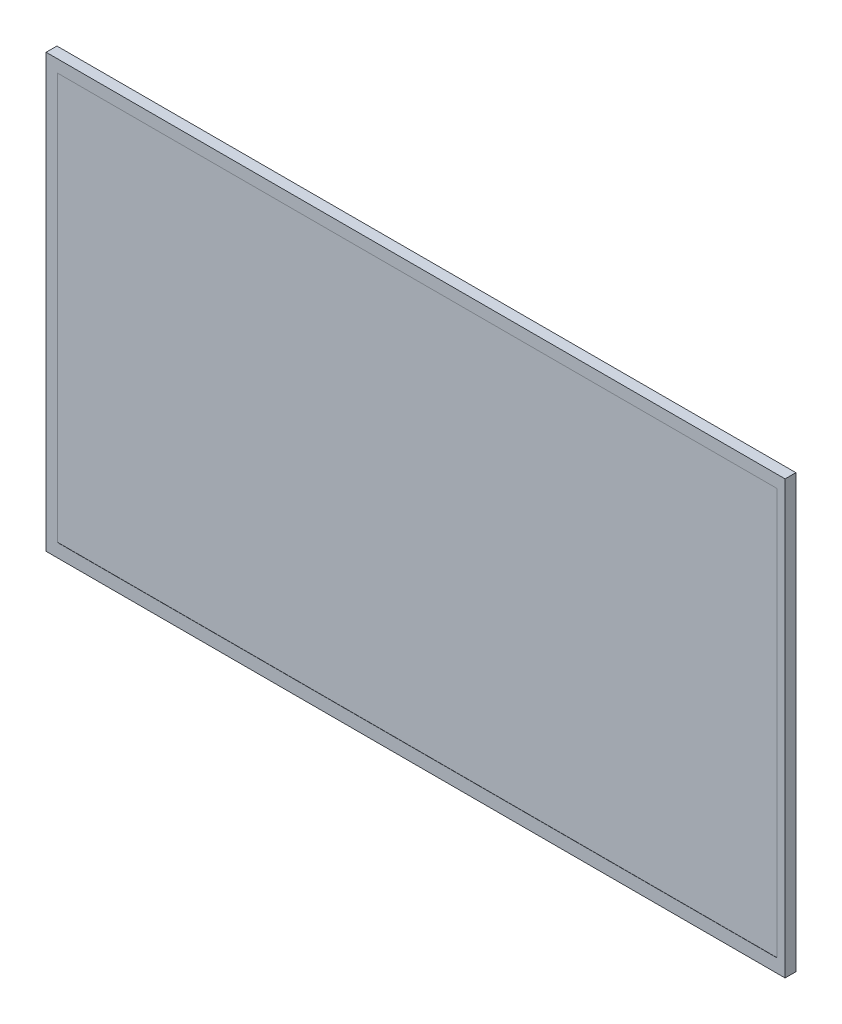
ISO-10303-21;
HEADER;
FILE_DESCRIPTION(('STEP AP214'),'2;1');
FILE_NAME('part.step','',(''),(''),'','','');
FILE_SCHEMA(('AUTOMOTIVE_DESIGN { 1 0 10303 214 1 1 1 1 }'));
ENDSEC;
DATA;
#1=APPLICATION_CONTEXT('core data for automotive mechanical design processes');
#2=APPLICATION_PROTOCOL_DEFINITION('international standard','automotive_design',2000,#1);
#3=PRODUCT_CONTEXT('',#1,'mechanical');
#4=PRODUCT('Part','Part','',(#3));
#5=PRODUCT_RELATED_PRODUCT_CATEGORY('part','',(#4));
#6=PRODUCT_DEFINITION_FORMATION('','',#4);
#7=PRODUCT_DEFINITION_CONTEXT('part definition',#1,'design');
#8=PRODUCT_DEFINITION('design','',#6,#7);
#9=PRODUCT_DEFINITION_SHAPE('','',#8);
#10=(LENGTH_UNIT() NAMED_UNIT(*) SI_UNIT(.MILLI.,.METRE.));
#11=(NAMED_UNIT(*) PLANE_ANGLE_UNIT() SI_UNIT($,.RADIAN.));
#12=(NAMED_UNIT(*) SI_UNIT($,.STERADIAN.) SOLID_ANGLE_UNIT());
#13=UNCERTAINTY_MEASURE_WITH_UNIT(LENGTH_MEASURE(1.E-05),#10,'distance_accuracy_value','');
#14=(GEOMETRIC_REPRESENTATION_CONTEXT(3) GLOBAL_UNCERTAINTY_ASSIGNED_CONTEXT((#13)) GLOBAL_UNIT_ASSIGNED_CONTEXT((#10,
#11,#12)) REPRESENTATION_CONTEXT('',''));
#15=CARTESIAN_POINT('',(0.,0.,0.));
#16=DIRECTION('',(0.,0.,1.));
#17=DIRECTION('',(1.,0.,0.));
#18=AXIS2_PLACEMENT_3D('',#15,#16,#17);
#19=CARTESIAN_POINT('',(0.,0.,0.));
#20=DIRECTION('',(0.,0.,1.));
#21=DIRECTION('',(1.,0.,0.));
#22=AXIS2_PLACEMENT_3D('',#19,#20,#21);
#23=PLANE('',#22);
#24=DIRECTION('',(0.,-1.,0.));
#25=VECTOR('',#24,1.);
#26=CARTESIAN_POINT('',(113.5,-64.,0.));
#27=LINE('',#26,#25);
#28=CARTESIAN_POINT('',(113.5,-64.,0.));
#29=VERTEX_POINT('',#28);
#30=CARTESIAN_POINT('',(113.5,-105.,0.));
#31=VERTEX_POINT('',#30);
#32=EDGE_CURVE('E48',#29,#31,#27,.T.);
#33=ORIENTED_EDGE('',*,*,#32,.F.);
#34=DIRECTION('',(1.,0.,0.));
#35=VECTOR('',#34,1.);
#36=CARTESIAN_POINT('',(113.5,-64.,0.));
#37=LINE('',#36,#35);
#38=CARTESIAN_POINT('',(-113.,-64.,0.));
#39=VERTEX_POINT('',#38);
#40=EDGE_CURVE('E211',#39,#29,#37,.T.);
#41=ORIENTED_EDGE('',*,*,#40,.F.);
#42=DIRECTION('',(0.,1.,0.));
#43=VECTOR('',#42,1.);
#44=CARTESIAN_POINT('',(-113.,-64.,0.));
#45=LINE('',#44,#43);
#46=CARTESIAN_POINT('',(-113.,-105.,0.));
#47=VERTEX_POINT('',#46);
#48=EDGE_CURVE('E382',#47,#39,#45,.T.);
#49=ORIENTED_EDGE('',*,*,#48,.F.);
#50=DIRECTION('',(1.,0.,0.));
#51=VECTOR('',#50,1.);
#52=CARTESIAN_POINT('',(-179.5,-105.,0.));
#53=LINE('',#52,#51);
#54=CARTESIAN_POINT('',(-179.5,-105.,0.));
#55=VERTEX_POINT('',#54);
#56=EDGE_CURVE('E358',#55,#47,#53,.T.);
#57=ORIENTED_EDGE('',*,*,#56,.F.);
#58=DIRECTION('',(0.,-1.,0.));
#59=VECTOR('',#58,1.);
#60=CARTESIAN_POINT('',(-179.5,105.,0.));
#61=LINE('',#60,#59);
#62=CARTESIAN_POINT('',(-179.5,105.,0.));
#63=VERTEX_POINT('',#62);
#64=EDGE_CURVE('E337',#63,#55,#61,.T.);
#65=ORIENTED_EDGE('',*,*,#64,.F.);
#66=DIRECTION('',(-1.,0.,0.));
#67=VECTOR('',#66,1.);
#68=CARTESIAN_POINT('',(-179.5,105.,0.));
#69=LINE('',#68,#67);
#70=CARTESIAN_POINT('',(179.5,105.,0.));
#71=VERTEX_POINT('',#70);
#72=EDGE_CURVE('E348',#71,#63,#69,.T.);
#73=ORIENTED_EDGE('',*,*,#72,.F.);
#74=DIRECTION('',(0.,1.,0.));
#75=VECTOR('',#74,1.);
#76=CARTESIAN_POINT('',(179.5,105.,0.));
#77=LINE('',#76,#75);
#78=CARTESIAN_POINT('',(179.5,-105.,0.));
#79=VERTEX_POINT('',#78);
#80=EDGE_CURVE('E360',#79,#71,#77,.T.);
#81=ORIENTED_EDGE('',*,*,#80,.F.);
#82=EDGE_CURVE('E357',#31,#79,#53,.T.);
#83=ORIENTED_EDGE('',*,*,#82,.F.);
#84=EDGE_LOOP('',(#33,#41,#49,#57,#65,#73,#81,#83));
#85=FACE_BOUND('',#84,.T.);
#86=ADVANCED_FACE('F33',(#85),#23,.F.);
#87=CARTESIAN_POINT('',(-179.5,105.,5.25));
#88=DIRECTION('',(1.,0.,0.));
#89=DIRECTION('',(0.,0.,-1.));
#90=AXIS2_PLACEMENT_3D('',#87,#88,#89);
#91=PLANE('',#90);
#92=ORIENTED_EDGE('',*,*,#64,.T.);
#93=DIRECTION('',(0.,0.,-1.));
#94=VECTOR('',#93,1.);
#95=CARTESIAN_POINT('',(-179.5,-105.,5.25));
#96=LINE('',#95,#94);
#97=CARTESIAN_POINT('',(-179.5,-105.,5.25));
#98=VERTEX_POINT('',#97);
#99=EDGE_CURVE('E41',#98,#55,#96,.T.);
#100=ORIENTED_EDGE('',*,*,#99,.F.);
#101=DIRECTION('',(0.,-1.,0.));
#102=VECTOR('',#101,1.);
#103=CARTESIAN_POINT('',(-179.5,105.,5.25));
#104=LINE('',#103,#102);
#105=CARTESIAN_POINT('',(-179.5,105.,5.25));
#106=VERTEX_POINT('',#105);
#107=EDGE_CURVE('E344',#106,#98,#104,.T.);
#108=ORIENTED_EDGE('',*,*,#107,.F.);
#109=DIRECTION('',(0.,0.,-1.));
#110=VECTOR('',#109,1.);
#111=CARTESIAN_POINT('',(-179.5,105.,5.25));
#112=LINE('',#111,#110);
#113=EDGE_CURVE('E354',#106,#63,#112,.T.);
#114=ORIENTED_EDGE('',*,*,#113,.T.);
#115=EDGE_LOOP('',(#92,#100,#108,#114));
#116=FACE_BOUND('',#115,.T.);
#117=ADVANCED_FACE('F35',(#116),#91,.F.);
#118=CARTESIAN_POINT('',(-179.5,-105.,5.25));
#119=DIRECTION('',(0.,1.,0.));
#120=DIRECTION('',(0.,0.,1.));
#121=AXIS2_PLACEMENT_3D('',#118,#119,#120);
#122=PLANE('',#121);
#123=ORIENTED_EDGE('',*,*,#56,.T.);
#124=DIRECTION('',(0.,0.,1.));
#125=VECTOR('',#124,1.);
#126=CARTESIAN_POINT('',(-113.,-105.,-0.25));
#127=LINE('',#126,#125);
#128=CARTESIAN_POINT('',(-113.,-105.,-0.25));
#129=VERTEX_POINT('',#128);
#130=EDGE_CURVE('E200',#129,#47,#127,.T.);
#131=ORIENTED_EDGE('',*,*,#130,.F.);
#132=DIRECTION('',(-1.,0.,0.));
#133=VECTOR('',#132,1.);
#134=CARTESIAN_POINT('',(113.5,-105.,-0.25));
#135=LINE('',#134,#133);
#136=CARTESIAN_POINT('',(113.5,-105.,-0.25));
#137=VERTEX_POINT('',#136);
#138=EDGE_CURVE('E194',#137,#129,#135,.T.);
#139=ORIENTED_EDGE('',*,*,#138,.F.);
#140=DIRECTION('',(0.,0.,1.));
#141=VECTOR('',#140,1.);
#142=CARTESIAN_POINT('',(113.5,-105.,-0.25));
#143=LINE('',#142,#141);
#144=EDGE_CURVE('E198',#137,#31,#143,.T.);
#145=ORIENTED_EDGE('',*,*,#144,.T.);
#146=ORIENTED_EDGE('',*,*,#82,.T.);
#147=DIRECTION('',(0.,0.,-1.));
#148=VECTOR('',#147,1.);
#149=CARTESIAN_POINT('',(179.5,-105.,5.25));
#150=LINE('',#149,#148);
#151=CARTESIAN_POINT('',(179.5,-105.,5.25));
#152=VERTEX_POINT('',#151);
#153=EDGE_CURVE('E368',#152,#79,#150,.T.);
#154=ORIENTED_EDGE('',*,*,#153,.F.);
#155=DIRECTION('',(1.,0.,0.));
#156=VECTOR('',#155,1.);
#157=CARTESIAN_POINT('',(-179.5,-105.,5.25));
#158=LINE('',#157,#156);
#159=EDGE_CURVE('E347',#98,#152,#158,.T.);
#160=ORIENTED_EDGE('',*,*,#159,.F.);
#161=ORIENTED_EDGE('',*,*,#99,.T.);
#162=EDGE_LOOP('',(#123,#131,#139,#145,#146,#154,#160,#161));
#163=FACE_BOUND('',#162,.T.);
#164=ADVANCED_FACE('F197',(#163),#122,.F.);
#165=CARTESIAN_POINT('',(179.5,105.,5.25));
#166=DIRECTION('',(-1.,0.,0.));
#167=DIRECTION('',(0.,-1.,0.));
#168=AXIS2_PLACEMENT_3D('',#165,#166,#167);
#169=PLANE('',#168);
#170=ORIENTED_EDGE('',*,*,#80,.T.);
#171=DIRECTION('',(0.,0.,-1.));
#172=VECTOR('',#171,1.);
#173=CARTESIAN_POINT('',(179.5,105.,5.25));
#174=LINE('',#173,#172);
#175=CARTESIAN_POINT('',(179.5,105.,5.25));
#176=VERTEX_POINT('',#175);
#177=EDGE_CURVE('E365',#176,#71,#174,.T.);
#178=ORIENTED_EDGE('',*,*,#177,.F.);
#179=DIRECTION('',(0.,1.,0.));
#180=VECTOR('',#179,1.);
#181=CARTESIAN_POINT('',(179.5,105.,5.25));
#182=LINE('',#181,#180);
#183=EDGE_CURVE('E350',#152,#176,#182,.T.);
#184=ORIENTED_EDGE('',*,*,#183,.F.);
#185=ORIENTED_EDGE('',*,*,#153,.T.);
#186=EDGE_LOOP('',(#170,#178,#184,#185));
#187=FACE_BOUND('',#186,.T.);
#188=ADVANCED_FACE('F417',(#187),#169,.F.);
#189=CARTESIAN_POINT('',(-179.5,105.,5.25));
#190=DIRECTION('',(0.,-1.,0.));
#191=DIRECTION('',(0.,0.,-1.));
#192=AXIS2_PLACEMENT_3D('',#189,#190,#191);
#193=PLANE('',#192);
#194=ORIENTED_EDGE('',*,*,#72,.T.);
#195=ORIENTED_EDGE('',*,*,#113,.F.);
#196=DIRECTION('',(-1.,0.,0.));
#197=VECTOR('',#196,1.);
#198=CARTESIAN_POINT('',(-179.5,105.,5.25));
#199=LINE('',#198,#197);
#200=EDGE_CURVE('E352',#176,#106,#199,.T.);
#201=ORIENTED_EDGE('',*,*,#200,.F.);
#202=ORIENTED_EDGE('',*,*,#177,.T.);
#203=EDGE_LOOP('',(#194,#195,#201,#202));
#204=FACE_BOUND('',#203,.T.);
#205=ADVANCED_FACE('F414',(#204),#193,.F.);
#206=CARTESIAN_POINT('',(0.,0.,5.25));
#207=DIRECTION('',(0.,0.,1.));
#208=DIRECTION('',(1.,0.,0.));
#209=AXIS2_PLACEMENT_3D('',#206,#207,#208);
#210=PLANE('',#209);
#211=DIRECTION('',(0.,-1.,0.));
#212=VECTOR('',#211,1.);
#213=CARTESIAN_POINT('',(-174.,99.,5.25));
#214=LINE('',#213,#212);
#215=CARTESIAN_POINT('',(-174.,99.,5.25));
#216=VERTEX_POINT('',#215);
#217=CARTESIAN_POINT('',(-174.,-98.5,5.25));
#218=VERTEX_POINT('',#217);
#219=EDGE_CURVE('E311',#216,#218,#214,.T.);
#220=ORIENTED_EDGE('',*,*,#219,.F.);
#221=DIRECTION('',(-1.,0.,0.));
#222=VECTOR('',#221,1.);
#223=CARTESIAN_POINT('',(-174.,99.,5.25));
#224=LINE('',#223,#222);
#225=CARTESIAN_POINT('',(175.5,99.,5.25));
#226=VERTEX_POINT('',#225);
#227=EDGE_CURVE('E316',#226,#216,#224,.T.);
#228=ORIENTED_EDGE('',*,*,#227,.F.);
#229=DIRECTION('',(0.,1.,0.));
#230=VECTOR('',#229,1.);
#231=CARTESIAN_POINT('',(175.5,99.,5.25));
#232=LINE('',#231,#230);
#233=CARTESIAN_POINT('',(175.5,-98.5,5.25));
#234=VERTEX_POINT('',#233);
#235=EDGE_CURVE('E330',#234,#226,#232,.T.);
#236=ORIENTED_EDGE('',*,*,#235,.F.);
#237=DIRECTION('',(1.,0.,0.));
#238=VECTOR('',#237,1.);
#239=CARTESIAN_POINT('',(-174.,-98.5,5.25));
#240=LINE('',#239,#238);
#241=EDGE_CURVE('E327',#218,#234,#240,.T.);
#242=ORIENTED_EDGE('',*,*,#241,.F.);
#243=EDGE_LOOP('',(#220,#228,#236,#242));
#244=FACE_BOUND('',#243,.T.);
#245=ORIENTED_EDGE('',*,*,#107,.T.);
#246=ORIENTED_EDGE('',*,*,#159,.T.);
#247=ORIENTED_EDGE('',*,*,#183,.T.);
#248=ORIENTED_EDGE('',*,*,#200,.T.);
#249=EDGE_LOOP('',(#245,#246,#247,#248));
#250=FACE_BOUND('',#249,.T.);
#251=ADVANCED_FACE('F412',(#244,#250),#210,.T.);
#252=CARTESIAN_POINT('',(-174.,99.,5.15));
#253=DIRECTION('',(-1.,0.,0.));
#254=DIRECTION('',(0.,-1.,0.));
#255=AXIS2_PLACEMENT_3D('',#252,#253,#254);
#256=PLANE('',#255);
#257=ORIENTED_EDGE('',*,*,#219,.T.);
#258=DIRECTION('',(0.,0.,1.));
#259=VECTOR('',#258,1.);
#260=CARTESIAN_POINT('',(-174.,-98.5,5.15));
#261=LINE('',#260,#259);
#262=CARTESIAN_POINT('',(-174.,-98.5,5.15));
#263=VERTEX_POINT('',#262);
#264=EDGE_CURVE('E325',#263,#218,#261,.T.);
#265=ORIENTED_EDGE('',*,*,#264,.F.);
#266=DIRECTION('',(0.,-1.,0.));
#267=VECTOR('',#266,1.);
#268=CARTESIAN_POINT('',(-174.,99.,5.15));
#269=LINE('',#268,#267);
#270=CARTESIAN_POINT('',(-174.,99.,5.15));
#271=VERTEX_POINT('',#270);
#272=EDGE_CURVE('E312',#271,#263,#269,.T.);
#273=ORIENTED_EDGE('',*,*,#272,.F.);
#274=DIRECTION('',(0.,0.,1.));
#275=VECTOR('',#274,1.);
#276=CARTESIAN_POINT('',(-174.,99.,5.15));
#277=LINE('',#276,#275);
#278=EDGE_CURVE('E335',#271,#216,#277,.T.);
#279=ORIENTED_EDGE('',*,*,#278,.T.);
#280=EDGE_LOOP('',(#257,#265,#273,#279));
#281=FACE_BOUND('',#280,.T.);
#282=ADVANCED_FACE('F441',(#281),#256,.F.);
#283=CARTESIAN_POINT('',(-174.,99.,5.15));
#284=DIRECTION('',(0.,1.,0.));
#285=DIRECTION('',(0.,0.,1.));
#286=AXIS2_PLACEMENT_3D('',#283,#284,#285);
#287=PLANE('',#286);
#288=ORIENTED_EDGE('',*,*,#227,.T.);
#289=ORIENTED_EDGE('',*,*,#278,.F.);
#290=DIRECTION('',(-1.,0.,0.));
#291=VECTOR('',#290,1.);
#292=CARTESIAN_POINT('',(-174.,99.,5.15));
#293=LINE('',#292,#291);
#294=CARTESIAN_POINT('',(175.5,99.,5.15));
#295=VERTEX_POINT('',#294);
#296=EDGE_CURVE('E322',#295,#271,#293,.T.);
#297=ORIENTED_EDGE('',*,*,#296,.F.);
#298=DIRECTION('',(0.,0.,1.));
#299=VECTOR('',#298,1.);
#300=CARTESIAN_POINT('',(175.5,99.,5.15));
#301=LINE('',#300,#299);
#302=EDGE_CURVE('E338',#295,#226,#301,.T.);
#303=ORIENTED_EDGE('',*,*,#302,.T.);
#304=EDGE_LOOP('',(#288,#289,#297,#303));
#305=FACE_BOUND('',#304,.T.);
#306=ADVANCED_FACE('F448',(#305),#287,.F.);
#307=CARTESIAN_POINT('',(175.5,99.,5.15));
#308=DIRECTION('',(1.,0.,0.));
#309=DIRECTION('',(0.,0.,-1.));
#310=AXIS2_PLACEMENT_3D('',#307,#308,#309);
#311=PLANE('',#310);
#312=ORIENTED_EDGE('',*,*,#235,.T.);
#313=ORIENTED_EDGE('',*,*,#302,.F.);
#314=DIRECTION('',(0.,1.,0.));
#315=VECTOR('',#314,1.);
#316=CARTESIAN_POINT('',(175.5,99.,5.15));
#317=LINE('',#316,#315);
#318=CARTESIAN_POINT('',(175.5,-98.5,5.15));
#319=VERTEX_POINT('',#318);
#320=EDGE_CURVE('E319',#319,#295,#317,.T.);
#321=ORIENTED_EDGE('',*,*,#320,.F.);
#322=DIRECTION('',(0.,0.,1.));
#323=VECTOR('',#322,1.);
#324=CARTESIAN_POINT('',(175.5,-98.5,5.15));
#325=LINE('',#324,#323);
#326=EDGE_CURVE('E340',#319,#234,#325,.T.);
#327=ORIENTED_EDGE('',*,*,#326,.T.);
#328=EDGE_LOOP('',(#312,#313,#321,#327));
#329=FACE_BOUND('',#328,.T.);
#330=ADVANCED_FACE('F455',(#329),#311,.F.);
#331=CARTESIAN_POINT('',(-174.,-98.5,5.15));
#332=DIRECTION('',(0.,-1.,0.));
#333=DIRECTION('',(1.,0.,0.));
#334=AXIS2_PLACEMENT_3D('',#331,#332,#333);
#335=PLANE('',#334);
#336=ORIENTED_EDGE('',*,*,#241,.T.);
#337=ORIENTED_EDGE('',*,*,#326,.F.);
#338=DIRECTION('',(1.,0.,0.));
#339=VECTOR('',#338,1.);
#340=CARTESIAN_POINT('',(-174.,-98.5,5.15));
#341=LINE('',#340,#339);
#342=EDGE_CURVE('E315',#263,#319,#341,.T.);
#343=ORIENTED_EDGE('',*,*,#342,.F.);
#344=ORIENTED_EDGE('',*,*,#264,.T.);
#345=EDGE_LOOP('',(#336,#337,#343,#344));
#346=FACE_BOUND('',#345,.T.);
#347=ADVANCED_FACE('F463',(#346),#335,.F.);
#348=CARTESIAN_POINT('',(0.,0.,5.15));
#349=DIRECTION('',(0.,0.,1.));
#350=DIRECTION('',(1.,0.,0.));
#351=AXIS2_PLACEMENT_3D('',#348,#349,#350);
#352=PLANE('',#351);
#353=ORIENTED_EDGE('',*,*,#272,.T.);
#354=ORIENTED_EDGE('',*,*,#342,.T.);
#355=ORIENTED_EDGE('',*,*,#320,.T.);
#356=ORIENTED_EDGE('',*,*,#296,.T.);
#357=EDGE_LOOP('',(#353,#354,#355,#356));
#358=FACE_BOUND('',#357,.T.);
#359=ADVANCED_FACE('F471',(#358),#352,.T.);
#360=CARTESIAN_POINT('',(0.,0.,-0.25));
#361=DIRECTION('',(0.,0.,-1.));
#362=DIRECTION('',(-1.,0.,0.));
#363=AXIS2_PLACEMENT_3D('',#360,#361,#362);
#364=PLANE('',#363);
#365=DIRECTION('',(0.,-1.,0.));
#366=VECTOR('',#365,1.);
#367=CARTESIAN_POINT('',(113.5,-64.,-0.25));
#368=LINE('',#367,#366);
#369=CARTESIAN_POINT('',(113.5,-64.,-0.25));
#370=VERTEX_POINT('',#369);
#371=EDGE_CURVE('E204',#370,#137,#368,.T.);
#372=ORIENTED_EDGE('',*,*,#371,.T.);
#373=ORIENTED_EDGE('',*,*,#138,.T.);
#374=DIRECTION('',(0.,1.,0.));
#375=VECTOR('',#374,1.);
#376=CARTESIAN_POINT('',(-113.,-64.,-0.25));
#377=LINE('',#376,#375);
#378=CARTESIAN_POINT('',(-113.,-64.,-0.25));
#379=VERTEX_POINT('',#378);
#380=EDGE_CURVE('E203',#129,#379,#377,.T.);
#381=ORIENTED_EDGE('',*,*,#380,.T.);
#382=DIRECTION('',(1.,0.,0.));
#383=VECTOR('',#382,1.);
#384=CARTESIAN_POINT('',(113.5,-64.,-0.25));
#385=LINE('',#384,#383);
#386=EDGE_CURVE('E209',#379,#370,#385,.T.);
#387=ORIENTED_EDGE('',*,*,#386,.T.);
#388=EDGE_LOOP('',(#372,#373,#381,#387));
#389=FACE_BOUND('',#388,.T.);
#390=DIRECTION('',(0.,-1.,0.));
#391=VECTOR('',#390,1.);
#392=CARTESIAN_POINT('',(74.3,-66.,-0.25));
#393=LINE('',#392,#391);
#394=CARTESIAN_POINT('',(74.3,-66.,-0.25));
#395=VERTEX_POINT('',#394);
#396=CARTESIAN_POINT('',(74.3,-70.,-0.25));
#397=VERTEX_POINT('',#396);
#398=EDGE_CURVE('E56',#395,#397,#393,.T.);
#399=ORIENTED_EDGE('',*,*,#398,.F.);
#400=DIRECTION('',(1.,0.,0.));
#401=VECTOR('',#400,1.);
#402=CARTESIAN_POINT('',(74.3,-66.,-0.25));
#403=LINE('',#402,#401);
#404=CARTESIAN_POINT('',(71.8,-66.,-0.25));
#405=VERTEX_POINT('',#404);
#406=EDGE_CURVE('E11',#405,#395,#403,.T.);
#407=ORIENTED_EDGE('',*,*,#406,.F.);
#408=DIRECTION('',(0.,1.,0.));
#409=VECTOR('',#408,1.);
#410=CARTESIAN_POINT('',(71.8,-66.,-0.25));
#411=LINE('',#410,#409);
#412=CARTESIAN_POINT('',(71.8,-67.,-0.25));
#413=VERTEX_POINT('',#412);
#414=EDGE_CURVE('E214',#413,#405,#411,.T.);
#415=ORIENTED_EDGE('',*,*,#414,.F.);
#416=DIRECTION('',(1.,0.,0.));
#417=VECTOR('',#416,1.);
#418=CARTESIAN_POINT('',(71.8,-67.,-0.25));
#419=LINE('',#418,#417);
#420=CARTESIAN_POINT('',(50.8000000000001,-67.,-0.25));
#421=VERTEX_POINT('',#420);
#422=EDGE_CURVE('E217',#421,#413,#419,.T.);
#423=ORIENTED_EDGE('',*,*,#422,.F.);
#424=DIRECTION('',(0.,-1.,0.));
#425=VECTOR('',#424,1.);
#426=CARTESIAN_POINT('',(50.8000000000002,-66.,-0.25));
#427=LINE('',#426,#425);
#428=CARTESIAN_POINT('',(50.8000000000002,-66.,-0.25));
#429=VERTEX_POINT('',#428);
#430=EDGE_CURVE('E225',#429,#421,#427,.T.);
#431=ORIENTED_EDGE('',*,*,#430,.F.);
#432=DIRECTION('',(1.,0.,0.));
#433=VECTOR('',#432,1.);
#434=CARTESIAN_POINT('',(48.3000000000001,-66.,-0.25));
#435=LINE('',#434,#433);
#436=CARTESIAN_POINT('',(48.3000000000001,-66.,-0.25));
#437=VERTEX_POINT('',#436);
#438=EDGE_CURVE('E228',#437,#429,#435,.T.);
#439=ORIENTED_EDGE('',*,*,#438,.F.);
#440=DIRECTION('',(0.,1.,0.));
#441=VECTOR('',#440,1.);
#442=CARTESIAN_POINT('',(48.3000000000001,-66.,-0.25));
#443=LINE('',#442,#441);
#444=CARTESIAN_POINT('',(48.3000000000001,-70.,-0.25));
#445=VERTEX_POINT('',#444);
#446=EDGE_CURVE('E231',#445,#437,#443,.T.);
#447=ORIENTED_EDGE('',*,*,#446,.F.);
#448=DIRECTION('',(-1.,0.,0.));
#449=VECTOR('',#448,1.);
#450=CARTESIAN_POINT('',(48.3000000000001,-70.,-0.25));
#451=LINE('',#450,#449);
#452=CARTESIAN_POINT('',(50.8000000000002,-70.,-0.25));
#453=VERTEX_POINT('',#452);
#454=EDGE_CURVE('E234',#453,#445,#451,.T.);
#455=ORIENTED_EDGE('',*,*,#454,.F.);
#456=DIRECTION('',(0.,-1.,0.));
#457=VECTOR('',#456,1.);
#458=CARTESIAN_POINT('',(50.8000000000001,-69.,-0.25));
#459=LINE('',#458,#457);
#460=CARTESIAN_POINT('',(50.8000000000001,-69.,-0.25));
#461=VERTEX_POINT('',#460);
#462=EDGE_CURVE('E237',#461,#453,#459,.T.);
#463=ORIENTED_EDGE('',*,*,#462,.F.);
#464=DIRECTION('',(-1.,0.,0.));
#465=VECTOR('',#464,1.);
#466=CARTESIAN_POINT('',(71.8,-69.,-0.25));
#467=LINE('',#466,#465);
#468=CARTESIAN_POINT('',(71.8,-69.,-0.25));
#469=VERTEX_POINT('',#468);
#470=EDGE_CURVE('E240',#469,#461,#467,.T.);
#471=ORIENTED_EDGE('',*,*,#470,.F.);
#472=DIRECTION('',(0.,1.,0.));
#473=VECTOR('',#472,1.);
#474=CARTESIAN_POINT('',(71.8,-69.,-0.25));
#475=LINE('',#474,#473);
#476=CARTESIAN_POINT('',(71.8,-70.,-0.25));
#477=VERTEX_POINT('',#476);
#478=EDGE_CURVE('E243',#477,#469,#475,.T.);
#479=ORIENTED_EDGE('',*,*,#478,.F.);
#480=DIRECTION('',(-1.,0.,0.));
#481=VECTOR('',#480,1.);
#482=CARTESIAN_POINT('',(74.3,-70.,-0.25));
#483=LINE('',#482,#481);
#484=EDGE_CURVE('E246',#397,#477,#483,.T.);
#485=ORIENTED_EDGE('',*,*,#484,.F.);
#486=EDGE_LOOP('',(#399,#407,#415,#423,#431,#439,#447,#455,#463,#471,#479,#485));
#487=FACE_BOUND('',#486,.T.);
#488=ADVANCED_FACE('F207',(#389,#487),#364,.T.);
#489=CARTESIAN_POINT('',(113.5,-64.,-0.25));
#490=DIRECTION('',(-1.,0.,0.));
#491=DIRECTION('',(0.,0.,1.));
#492=AXIS2_PLACEMENT_3D('',#489,#490,#491);
#493=PLANE('',#492);
#494=ORIENTED_EDGE('',*,*,#32,.T.);
#495=ORIENTED_EDGE('',*,*,#144,.F.);
#496=ORIENTED_EDGE('',*,*,#371,.F.);
#497=DIRECTION('',(0.,0.,1.));
#498=VECTOR('',#497,1.);
#499=CARTESIAN_POINT('',(113.5,-64.,-0.25));
#500=LINE('',#499,#498);
#501=EDGE_CURVE('E391',#370,#29,#500,.T.);
#502=ORIENTED_EDGE('',*,*,#501,.T.);
#503=EDGE_LOOP('',(#494,#495,#496,#502));
#504=FACE_BOUND('',#503,.T.);
#505=ADVANCED_FACE('F213',(#504),#493,.F.);
#506=CARTESIAN_POINT('',(-113.,-64.,-0.25));
#507=DIRECTION('',(1.,0.,0.));
#508=DIRECTION('',(0.,0.,-1.));
#509=AXIS2_PLACEMENT_3D('',#506,#507,#508);
#510=PLANE('',#509);
#511=ORIENTED_EDGE('',*,*,#48,.T.);
#512=DIRECTION('',(0.,0.,1.));
#513=VECTOR('',#512,1.);
#514=CARTESIAN_POINT('',(-113.,-64.,-0.25));
#515=LINE('',#514,#513);
#516=EDGE_CURVE('E219',#379,#39,#515,.T.);
#517=ORIENTED_EDGE('',*,*,#516,.F.);
#518=ORIENTED_EDGE('',*,*,#380,.F.);
#519=ORIENTED_EDGE('',*,*,#130,.T.);
#520=EDGE_LOOP('',(#511,#517,#518,#519));
#521=FACE_BOUND('',#520,.T.);
#522=ADVANCED_FACE('F394',(#521),#510,.F.);
#523=CARTESIAN_POINT('',(113.5,-64.,-0.25));
#524=DIRECTION('',(0.,-1.,0.));
#525=DIRECTION('',(0.,0.,-1.));
#526=AXIS2_PLACEMENT_3D('',#523,#524,#525);
#527=PLANE('',#526);
#528=ORIENTED_EDGE('',*,*,#40,.T.);
#529=ORIENTED_EDGE('',*,*,#501,.F.);
#530=ORIENTED_EDGE('',*,*,#386,.F.);
#531=ORIENTED_EDGE('',*,*,#516,.T.);
#532=EDGE_LOOP('',(#528,#529,#530,#531));
#533=FACE_BOUND('',#532,.T.);
#534=ADVANCED_FACE('F393',(#533),#527,.F.);
#535=CARTESIAN_POINT('',(0.,0.,-1.));
#536=DIRECTION('',(0.,0.,-1.));
#537=DIRECTION('',(-1.,0.,0.));
#538=AXIS2_PLACEMENT_3D('',#535,#536,#537);
#539=PLANE('',#538);
#540=DIRECTION('',(0.,-1.,0.));
#541=VECTOR('',#540,1.);
#542=CARTESIAN_POINT('',(74.3,-66.,-1.));
#543=LINE('',#542,#541);
#544=CARTESIAN_POINT('',(74.3,-66.,-1.));
#545=VERTEX_POINT('',#544);
#546=CARTESIAN_POINT('',(74.3,-70.,-1.));
#547=VERTEX_POINT('',#546);
#548=EDGE_CURVE('E250',#545,#547,#543,.T.);
#549=ORIENTED_EDGE('',*,*,#548,.T.);
#550=DIRECTION('',(-1.,0.,0.));
#551=VECTOR('',#550,1.);
#552=CARTESIAN_POINT('',(74.3,-70.,-1.));
#553=LINE('',#552,#551);
#554=CARTESIAN_POINT('',(71.8,-70.,-1.));
#555=VERTEX_POINT('',#554);
#556=EDGE_CURVE('E253',#547,#555,#553,.T.);
#557=ORIENTED_EDGE('',*,*,#556,.T.);
#558=DIRECTION('',(0.,1.,0.));
#559=VECTOR('',#558,1.);
#560=CARTESIAN_POINT('',(71.8,-69.,-1.));
#561=LINE('',#560,#559);
#562=CARTESIAN_POINT('',(71.8,-69.,-1.));
#563=VERTEX_POINT('',#562);
#564=EDGE_CURVE('E255',#555,#563,#561,.T.);
#565=ORIENTED_EDGE('',*,*,#564,.T.);
#566=DIRECTION('',(-1.,0.,0.));
#567=VECTOR('',#566,1.);
#568=CARTESIAN_POINT('',(71.8,-69.,-1.));
#569=LINE('',#568,#567);
#570=CARTESIAN_POINT('',(50.8000000000001,-69.,-1.));
#571=VERTEX_POINT('',#570);
#572=EDGE_CURVE('E257',#563,#571,#569,.T.);
#573=ORIENTED_EDGE('',*,*,#572,.T.);
#574=DIRECTION('',(0.,-1.,0.));
#575=VECTOR('',#574,1.);
#576=CARTESIAN_POINT('',(50.8000000000001,-69.,-1.));
#577=LINE('',#576,#575);
#578=CARTESIAN_POINT('',(50.8000000000002,-70.,-1.));
#579=VERTEX_POINT('',#578);
#580=EDGE_CURVE('E259',#571,#579,#577,.T.);
#581=ORIENTED_EDGE('',*,*,#580,.T.);
#582=DIRECTION('',(-1.,0.,0.));
#583=VECTOR('',#582,1.);
#584=CARTESIAN_POINT('',(48.3000000000001,-70.,-1.));
#585=LINE('',#584,#583);
#586=CARTESIAN_POINT('',(48.3000000000001,-70.,-1.));
#587=VERTEX_POINT('',#586);
#588=EDGE_CURVE('E261',#579,#587,#585,.T.);
#589=ORIENTED_EDGE('',*,*,#588,.T.);
#590=DIRECTION('',(0.,1.,0.));
#591=VECTOR('',#590,1.);
#592=CARTESIAN_POINT('',(48.3000000000001,-66.,-1.));
#593=LINE('',#592,#591);
#594=CARTESIAN_POINT('',(48.3000000000001,-66.,-1.));
#595=VERTEX_POINT('',#594);
#596=EDGE_CURVE('E263',#587,#595,#593,.T.);
#597=ORIENTED_EDGE('',*,*,#596,.T.);
#598=DIRECTION('',(1.,0.,0.));
#599=VECTOR('',#598,1.);
#600=CARTESIAN_POINT('',(48.3000000000001,-66.,-1.));
#601=LINE('',#600,#599);
#602=CARTESIAN_POINT('',(50.8000000000002,-66.,-1.));
#603=VERTEX_POINT('',#602);
#604=EDGE_CURVE('E265',#595,#603,#601,.T.);
#605=ORIENTED_EDGE('',*,*,#604,.T.);
#606=DIRECTION('',(0.,-1.,0.));
#607=VECTOR('',#606,1.);
#608=CARTESIAN_POINT('',(50.8000000000002,-66.,-1.));
#609=LINE('',#608,#607);
#610=CARTESIAN_POINT('',(50.8000000000001,-67.,-1.));
#611=VERTEX_POINT('',#610);
#612=EDGE_CURVE('E267',#603,#611,#609,.T.);
#613=ORIENTED_EDGE('',*,*,#612,.T.);
#614=DIRECTION('',(1.,0.,0.));
#615=VECTOR('',#614,1.);
#616=CARTESIAN_POINT('',(71.8,-67.,-1.));
#617=LINE('',#616,#615);
#618=CARTESIAN_POINT('',(71.8,-67.,-1.));
#619=VERTEX_POINT('',#618);
#620=EDGE_CURVE('E269',#611,#619,#617,.T.);
#621=ORIENTED_EDGE('',*,*,#620,.T.);
#622=DIRECTION('',(0.,1.,0.));
#623=VECTOR('',#622,1.);
#624=CARTESIAN_POINT('',(71.8,-66.,-1.));
#625=LINE('',#624,#623);
#626=CARTESIAN_POINT('',(71.8,-66.,-1.));
#627=VERTEX_POINT('',#626);
#628=EDGE_CURVE('E271',#619,#627,#625,.T.);
#629=ORIENTED_EDGE('',*,*,#628,.T.);
#630=DIRECTION('',(1.,0.,0.));
#631=VECTOR('',#630,1.);
#632=CARTESIAN_POINT('',(74.3,-66.,-1.));
#633=LINE('',#632,#631);
#634=EDGE_CURVE('E273',#627,#545,#633,.T.);
#635=ORIENTED_EDGE('',*,*,#634,.T.);
#636=EDGE_LOOP('',(#549,#557,#565,#573,#581,#589,#597,#605,#613,#621,#629,#635));
#637=FACE_BOUND('',#636,.T.);
#638=ADVANCED_FACE('F402',(#637),#539,.T.);
#639=CARTESIAN_POINT('',(74.3,-66.,-1.));
#640=DIRECTION('',(0.,-1.,0.));
#641=DIRECTION('',(0.,0.,-1.));
#642=AXIS2_PLACEMENT_3D('',#639,#640,#641);
#643=PLANE('',#642);
#644=DIRECTION('',(0.,0.,1.));
#645=VECTOR('',#644,1.);
#646=CARTESIAN_POINT('',(71.8,-66.,-1.));
#647=LINE('',#646,#645);
#648=EDGE_CURVE('E278',#627,#405,#647,.T.);
#649=ORIENTED_EDGE('',*,*,#648,.T.);
#650=ORIENTED_EDGE('',*,*,#406,.T.);
#651=DIRECTION('',(0.,0.,1.));
#652=VECTOR('',#651,1.);
#653=CARTESIAN_POINT('',(74.3,-66.,-1.));
#654=LINE('',#653,#652);
#655=EDGE_CURVE('E275',#545,#395,#654,.T.);
#656=ORIENTED_EDGE('',*,*,#655,.F.);
#657=ORIENTED_EDGE('',*,*,#634,.F.);
#658=EDGE_LOOP('',(#649,#650,#656,#657));
#659=FACE_BOUND('',#658,.T.);
#660=ADVANCED_FACE('F506',(#659),#643,.F.);
#661=CARTESIAN_POINT('',(71.8,-66.,-1.));
#662=DIRECTION('',(1.,0.,0.));
#663=DIRECTION('',(0.,1.,0.));
#664=AXIS2_PLACEMENT_3D('',#661,#662,#663);
#665=PLANE('',#664);
#666=DIRECTION('',(0.,0.,1.));
#667=VECTOR('',#666,1.);
#668=CARTESIAN_POINT('',(71.8,-67.,-1.));
#669=LINE('',#668,#667);
#670=EDGE_CURVE('E281',#619,#413,#669,.T.);
#671=ORIENTED_EDGE('',*,*,#670,.T.);
#672=ORIENTED_EDGE('',*,*,#414,.T.);
#673=ORIENTED_EDGE('',*,*,#648,.F.);
#674=ORIENTED_EDGE('',*,*,#628,.F.);
#675=EDGE_LOOP('',(#671,#672,#673,#674));
#676=FACE_BOUND('',#675,.T.);
#677=ADVANCED_FACE('F511',(#676),#665,.F.);
#678=CARTESIAN_POINT('',(71.8,-67.,-1.));
#679=DIRECTION('',(0.,-1.,0.));
#680=DIRECTION('',(0.,0.,-1.));
#681=AXIS2_PLACEMENT_3D('',#678,#679,#680);
#682=PLANE('',#681);
#683=DIRECTION('',(0.,0.,1.));
#684=VECTOR('',#683,1.);
#685=CARTESIAN_POINT('',(50.8000000000001,-67.,-1.));
#686=LINE('',#685,#684);
#687=EDGE_CURVE('E284',#611,#421,#686,.T.);
#688=ORIENTED_EDGE('',*,*,#687,.T.);
#689=ORIENTED_EDGE('',*,*,#422,.T.);
#690=ORIENTED_EDGE('',*,*,#670,.F.);
#691=ORIENTED_EDGE('',*,*,#620,.F.);
#692=EDGE_LOOP('',(#688,#689,#690,#691));
#693=FACE_BOUND('',#692,.T.);
#694=ADVANCED_FACE('F522',(#693),#682,.F.);
#695=CARTESIAN_POINT('',(50.8000000000002,-66.,-1.));
#696=DIRECTION('',(-1.,0.,0.));
#697=DIRECTION('',(0.,-1.,0.));
#698=AXIS2_PLACEMENT_3D('',#695,#696,#697);
#699=PLANE('',#698);
#700=DIRECTION('',(0.,0.,1.));
#701=VECTOR('',#700,1.);
#702=CARTESIAN_POINT('',(50.8000000000002,-66.,-1.));
#703=LINE('',#702,#701);
#704=EDGE_CURVE('E287',#603,#429,#703,.T.);
#705=ORIENTED_EDGE('',*,*,#704,.T.);
#706=ORIENTED_EDGE('',*,*,#430,.T.);
#707=ORIENTED_EDGE('',*,*,#687,.F.);
#708=ORIENTED_EDGE('',*,*,#612,.F.);
#709=EDGE_LOOP('',(#705,#706,#707,#708));
#710=FACE_BOUND('',#709,.T.);
#711=ADVANCED_FACE('F532',(#710),#699,.F.);
#712=CARTESIAN_POINT('',(48.3000000000001,-66.,-1.));
#713=DIRECTION('',(0.,-1.,0.));
#714=DIRECTION('',(0.,0.,-1.));
#715=AXIS2_PLACEMENT_3D('',#712,#713,#714);
#716=PLANE('',#715);
#717=DIRECTION('',(0.,0.,1.));
#718=VECTOR('',#717,1.);
#719=CARTESIAN_POINT('',(48.3000000000001,-66.,-1.));
#720=LINE('',#719,#718);
#721=EDGE_CURVE('E290',#595,#437,#720,.T.);
#722=ORIENTED_EDGE('',*,*,#721,.T.);
#723=ORIENTED_EDGE('',*,*,#438,.T.);
#724=ORIENTED_EDGE('',*,*,#704,.F.);
#725=ORIENTED_EDGE('',*,*,#604,.F.);
#726=EDGE_LOOP('',(#722,#723,#724,#725));
#727=FACE_BOUND('',#726,.T.);
#728=ADVANCED_FACE('F542',(#727),#716,.F.);
#729=CARTESIAN_POINT('',(48.3000000000001,-66.,-1.));
#730=DIRECTION('',(1.,0.,0.));
#731=DIRECTION('',(0.,0.,-1.));
#732=AXIS2_PLACEMENT_3D('',#729,#730,#731);
#733=PLANE('',#732);
#734=DIRECTION('',(0.,0.,1.));
#735=VECTOR('',#734,1.);
#736=CARTESIAN_POINT('',(48.3000000000001,-70.,-1.));
#737=LINE('',#736,#735);
#738=EDGE_CURVE('E293',#587,#445,#737,.T.);
#739=ORIENTED_EDGE('',*,*,#738,.T.);
#740=ORIENTED_EDGE('',*,*,#446,.T.);
#741=ORIENTED_EDGE('',*,*,#721,.F.);
#742=ORIENTED_EDGE('',*,*,#596,.F.);
#743=EDGE_LOOP('',(#739,#740,#741,#742));
#744=FACE_BOUND('',#743,.T.);
#745=ADVANCED_FACE('F552',(#744),#733,.F.);
#746=CARTESIAN_POINT('',(48.3000000000001,-70.,-1.));
#747=DIRECTION('',(0.,1.,0.));
#748=DIRECTION('',(0.,0.,1.));
#749=AXIS2_PLACEMENT_3D('',#746,#747,#748);
#750=PLANE('',#749);
#751=DIRECTION('',(0.,0.,1.));
#752=VECTOR('',#751,1.);
#753=CARTESIAN_POINT('',(50.8000000000002,-70.,-1.));
#754=LINE('',#753,#752);
#755=EDGE_CURVE('E296',#579,#453,#754,.T.);
#756=ORIENTED_EDGE('',*,*,#755,.T.);
#757=ORIENTED_EDGE('',*,*,#454,.T.);
#758=ORIENTED_EDGE('',*,*,#738,.F.);
#759=ORIENTED_EDGE('',*,*,#588,.F.);
#760=EDGE_LOOP('',(#756,#757,#758,#759));
#761=FACE_BOUND('',#760,.T.);
#762=ADVANCED_FACE('F562',(#761),#750,.F.);
#763=CARTESIAN_POINT('',(50.8000000000001,-69.,-1.));
#764=DIRECTION('',(-1.,0.,0.));
#765=DIRECTION('',(0.,-1.,0.));
#766=AXIS2_PLACEMENT_3D('',#763,#764,#765);
#767=PLANE('',#766);
#768=DIRECTION('',(0.,0.,1.));
#769=VECTOR('',#768,1.);
#770=CARTESIAN_POINT('',(50.8000000000001,-69.,-1.));
#771=LINE('',#770,#769);
#772=EDGE_CURVE('E299',#571,#461,#771,.T.);
#773=ORIENTED_EDGE('',*,*,#772,.T.);
#774=ORIENTED_EDGE('',*,*,#462,.T.);
#775=ORIENTED_EDGE('',*,*,#755,.F.);
#776=ORIENTED_EDGE('',*,*,#580,.F.);
#777=EDGE_LOOP('',(#773,#774,#775,#776));
#778=FACE_BOUND('',#777,.T.);
#779=ADVANCED_FACE('F572',(#778),#767,.F.);
#780=CARTESIAN_POINT('',(71.8,-69.,-1.));
#781=DIRECTION('',(0.,1.,0.));
#782=DIRECTION('',(0.,0.,1.));
#783=AXIS2_PLACEMENT_3D('',#780,#781,#782);
#784=PLANE('',#783);
#785=DIRECTION('',(0.,0.,1.));
#786=VECTOR('',#785,1.);
#787=CARTESIAN_POINT('',(71.8,-69.,-1.));
#788=LINE('',#787,#786);
#789=EDGE_CURVE('E302',#563,#469,#788,.T.);
#790=ORIENTED_EDGE('',*,*,#789,.T.);
#791=ORIENTED_EDGE('',*,*,#470,.T.);
#792=ORIENTED_EDGE('',*,*,#772,.F.);
#793=ORIENTED_EDGE('',*,*,#572,.F.);
#794=EDGE_LOOP('',(#790,#791,#792,#793));
#795=FACE_BOUND('',#794,.T.);
#796=ADVANCED_FACE('F582',(#795),#784,.F.);
#797=CARTESIAN_POINT('',(71.8,-69.,-1.));
#798=DIRECTION('',(1.,0.,0.));
#799=DIRECTION('',(0.,1.,0.));
#800=AXIS2_PLACEMENT_3D('',#797,#798,#799);
#801=PLANE('',#800);
#802=DIRECTION('',(0.,0.,1.));
#803=VECTOR('',#802,1.);
#804=CARTESIAN_POINT('',(71.8,-70.,-1.));
#805=LINE('',#804,#803);
#806=EDGE_CURVE('E305',#555,#477,#805,.T.);
#807=ORIENTED_EDGE('',*,*,#806,.T.);
#808=ORIENTED_EDGE('',*,*,#478,.T.);
#809=ORIENTED_EDGE('',*,*,#789,.F.);
#810=ORIENTED_EDGE('',*,*,#564,.F.);
#811=EDGE_LOOP('',(#807,#808,#809,#810));
#812=FACE_BOUND('',#811,.T.);
#813=ADVANCED_FACE('F592',(#812),#801,.F.);
#814=CARTESIAN_POINT('',(74.3,-70.,-1.));
#815=DIRECTION('',(0.,1.,0.));
#816=DIRECTION('',(0.,0.,1.));
#817=AXIS2_PLACEMENT_3D('',#814,#815,#816);
#818=PLANE('',#817);
#819=DIRECTION('',(0.,0.,1.));
#820=VECTOR('',#819,1.);
#821=CARTESIAN_POINT('',(74.3,-70.,-1.));
#822=LINE('',#821,#820);
#823=EDGE_CURVE('E308',#547,#397,#822,.T.);
#824=ORIENTED_EDGE('',*,*,#823,.T.);
#825=ORIENTED_EDGE('',*,*,#484,.T.);
#826=ORIENTED_EDGE('',*,*,#806,.F.);
#827=ORIENTED_EDGE('',*,*,#556,.F.);
#828=EDGE_LOOP('',(#824,#825,#826,#827));
#829=FACE_BOUND('',#828,.T.);
#830=ADVANCED_FACE('F602',(#829),#818,.F.);
#831=CARTESIAN_POINT('',(74.3,-66.,-1.));
#832=DIRECTION('',(-1.,0.,0.));
#833=DIRECTION('',(0.,0.,1.));
#834=AXIS2_PLACEMENT_3D('',#831,#832,#833);
#835=PLANE('',#834);
#836=ORIENTED_EDGE('',*,*,#655,.T.);
#837=ORIENTED_EDGE('',*,*,#398,.T.);
#838=ORIENTED_EDGE('',*,*,#823,.F.);
#839=ORIENTED_EDGE('',*,*,#548,.F.);
#840=EDGE_LOOP('',(#836,#837,#838,#839));
#841=FACE_BOUND('',#840,.T.);
#842=ADVANCED_FACE('F612',(#841),#835,.F.);
#843=CLOSED_SHELL('',(#86,#117,#164,#188,#205,#251,#282,#306,#330,#347,#359,#488,#505,#522,#534,
#638,#660,#677,#694,#711,#728,#745,#762,#779,#796,#813,#830,#842));
#844=MANIFOLD_SOLID_BREP('B2',#843);
#845=ADVANCED_BREP_SHAPE_REPRESENTATION('',(#18,#844),#14);
#846=SHAPE_DEFINITION_REPRESENTATION(#9,#845);
ENDSEC;
END-ISO-10303-21;
